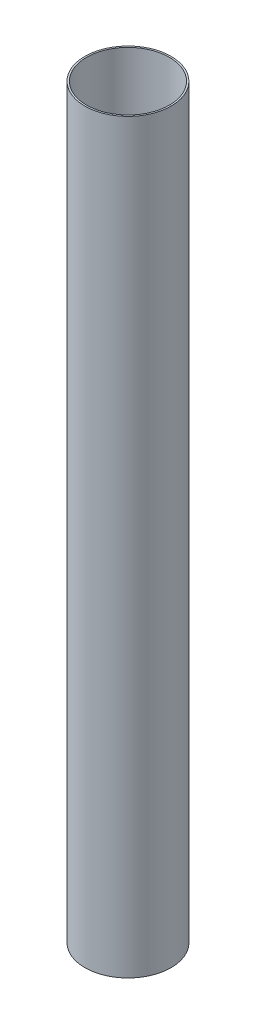
ISO-10303-21;
HEADER;
FILE_DESCRIPTION(('STEP AP214'),'2;1');
FILE_NAME('part.step','',(''),(''),'','','');
FILE_SCHEMA(('AUTOMOTIVE_DESIGN { 1 0 10303 214 1 1 1 1 }'));
ENDSEC;
DATA;
#1=APPLICATION_CONTEXT('core data for automotive mechanical design processes');
#2=APPLICATION_PROTOCOL_DEFINITION('international standard','automotive_design',2000,#1);
#3=PRODUCT_CONTEXT('',#1,'mechanical');
#4=PRODUCT('Part','Part','',(#3));
#5=PRODUCT_RELATED_PRODUCT_CATEGORY('part','',(#4));
#6=PRODUCT_DEFINITION_FORMATION('','',#4);
#7=PRODUCT_DEFINITION_CONTEXT('part definition',#1,'design');
#8=PRODUCT_DEFINITION('design','',#6,#7);
#9=PRODUCT_DEFINITION_SHAPE('','',#8);
#10=(LENGTH_UNIT() NAMED_UNIT(*) SI_UNIT(.MILLI.,.METRE.));
#11=(NAMED_UNIT(*) PLANE_ANGLE_UNIT() SI_UNIT($,.RADIAN.));
#12=(NAMED_UNIT(*) SI_UNIT($,.STERADIAN.) SOLID_ANGLE_UNIT());
#13=UNCERTAINTY_MEASURE_WITH_UNIT(LENGTH_MEASURE(1.E-05),#10,'distance_accuracy_value','');
#14=(GEOMETRIC_REPRESENTATION_CONTEXT(3) GLOBAL_UNCERTAINTY_ASSIGNED_CONTEXT((#13)) GLOBAL_UNIT_ASSIGNED_CONTEXT((#10,
#11,#12)) REPRESENTATION_CONTEXT('',''));
#15=CARTESIAN_POINT('',(0.,0.,0.));
#16=DIRECTION('',(0.,0.,1.));
#17=DIRECTION('',(1.,0.,0.));
#18=AXIS2_PLACEMENT_3D('',#15,#16,#17);
#19=CARTESIAN_POINT('',(0.,685.8,0.));
#20=DIRECTION('',(0.,1.,0.));
#21=DIRECTION('',(0.,0.,1.));
#22=AXIS2_PLACEMENT_3D('',#19,#20,#21);
#23=PLANE('',#22);
#24=CARTESIAN_POINT('',(0.,685.8,0.));
#25=DIRECTION('',(0.,1.,0.));
#26=DIRECTION('',(0.,0.,1.));
#27=AXIS2_PLACEMENT_3D('',#24,#25,#26);
#28=CIRCLE('',#27,39.624);
#29=CARTESIAN_POINT('',(0.,685.8,39.624));
#30=VERTEX_POINT('',#29);
#31=EDGE_CURVE('E10',#30,#30,#28,.T.);
#32=ORIENTED_EDGE('',*,*,#31,.T.);
#33=EDGE_LOOP('',(#32));
#34=FACE_BOUND('',#33,.T.);
#35=CARTESIAN_POINT('',(0.,685.8,0.));
#36=DIRECTION('',(0.,1.,0.));
#37=DIRECTION('',(0.,0.,1.));
#38=AXIS2_PLACEMENT_3D('',#35,#36,#37);
#39=CIRCLE('',#38,38.1);
#40=CARTESIAN_POINT('',(0.,685.8,38.1));
#41=VERTEX_POINT('',#40);
#42=EDGE_CURVE('E45',#41,#41,#39,.T.);
#43=ORIENTED_EDGE('',*,*,#42,.F.);
#44=EDGE_LOOP('',(#43));
#45=FACE_BOUND('',#44,.T.);
#46=ADVANCED_FACE('F34',(#34,#45),#23,.T.);
#47=CARTESIAN_POINT('',(0.,0.,0.));
#48=DIRECTION('',(0.,1.,0.));
#49=DIRECTION('',(0.,0.,1.));
#50=AXIS2_PLACEMENT_3D('',#47,#48,#49);
#51=PLANE('',#50);
#52=CARTESIAN_POINT('',(0.,0.,0.));
#53=DIRECTION('',(0.,1.,0.));
#54=DIRECTION('',(0.,0.,1.));
#55=AXIS2_PLACEMENT_3D('',#52,#53,#54);
#56=CIRCLE('',#55,39.624);
#57=CARTESIAN_POINT('',(0.,0.,39.624));
#58=VERTEX_POINT('',#57);
#59=EDGE_CURVE('E38',#58,#58,#56,.T.);
#60=ORIENTED_EDGE('',*,*,#59,.F.);
#61=EDGE_LOOP('',(#60));
#62=FACE_BOUND('',#61,.T.);
#63=CARTESIAN_POINT('',(0.,0.,0.));
#64=DIRECTION('',(0.,1.,0.));
#65=DIRECTION('',(0.,0.,1.));
#66=AXIS2_PLACEMENT_3D('',#63,#64,#65);
#67=CIRCLE('',#66,38.1);
#68=CARTESIAN_POINT('',(0.,0.,38.1));
#69=VERTEX_POINT('',#68);
#70=EDGE_CURVE('E47',#69,#69,#67,.T.);
#71=ORIENTED_EDGE('',*,*,#70,.T.);
#72=EDGE_LOOP('',(#71));
#73=FACE_BOUND('',#72,.T.);
#74=ADVANCED_FACE('F57',(#62,#73),#51,.F.);
#75=CARTESIAN_POINT('',(0.,685.8,0.));
#76=DIRECTION('',(0.,-1.,0.));
#77=DIRECTION('',(0.,0.,-1.));
#78=AXIS2_PLACEMENT_3D('',#75,#76,#77);
#79=CYLINDRICAL_SURFACE('',#78,39.624);
#80=ORIENTED_EDGE('',*,*,#31,.F.);
#81=EDGE_LOOP('',(#80));
#82=FACE_BOUND('',#81,.T.);
#83=ORIENTED_EDGE('',*,*,#59,.T.);
#84=EDGE_LOOP('',(#83));
#85=FACE_BOUND('',#84,.T.);
#86=ADVANCED_FACE('F36',(#82,#85),#79,.T.);
#87=CARTESIAN_POINT('',(0.,685.8,0.));
#88=DIRECTION('',(0.,-1.,0.));
#89=DIRECTION('',(0.,0.,-1.));
#90=AXIS2_PLACEMENT_3D('',#87,#88,#89);
#91=CYLINDRICAL_SURFACE('',#90,38.1);
#92=ORIENTED_EDGE('',*,*,#42,.T.);
#93=EDGE_LOOP('',(#92));
#94=FACE_BOUND('',#93,.T.);
#95=ORIENTED_EDGE('',*,*,#70,.F.);
#96=EDGE_LOOP('',(#95));
#97=FACE_BOUND('',#96,.T.);
#98=ADVANCED_FACE('F53',(#94,#97),#91,.F.);
#99=CLOSED_SHELL('',(#46,#74,#86,#98));
#100=MANIFOLD_SOLID_BREP('B2',#99);
#101=ADVANCED_BREP_SHAPE_REPRESENTATION('',(#18,#100),#14);
#102=SHAPE_DEFINITION_REPRESENTATION(#9,#101);
ENDSEC;
END-ISO-10303-21;
